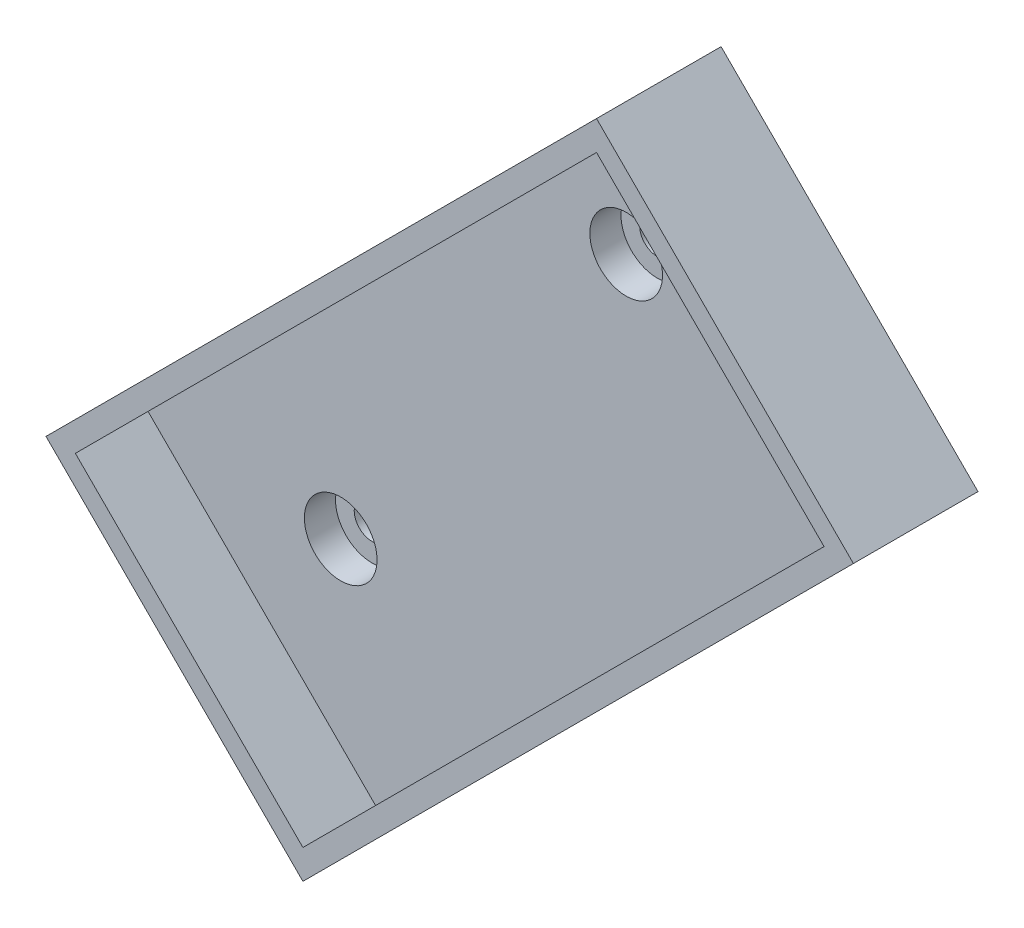
ISO-10303-21;
HEADER;
FILE_DESCRIPTION(('STEP AP214'),'2;1');
FILE_NAME('part.step','',(''),(''),'','','');
FILE_SCHEMA(('AUTOMOTIVE_DESIGN { 1 0 10303 214 1 1 1 1 }'));
ENDSEC;
DATA;
#1=APPLICATION_CONTEXT('core data for automotive mechanical design processes');
#2=APPLICATION_PROTOCOL_DEFINITION('international standard','automotive_design',2000,#1);
#3=PRODUCT_CONTEXT('',#1,'mechanical');
#4=PRODUCT('Part','Part','',(#3));
#5=PRODUCT_RELATED_PRODUCT_CATEGORY('part','',(#4));
#6=PRODUCT_DEFINITION_FORMATION('','',#4);
#7=PRODUCT_DEFINITION_CONTEXT('part definition',#1,'design');
#8=PRODUCT_DEFINITION('design','',#6,#7);
#9=PRODUCT_DEFINITION_SHAPE('','',#8);
#10=(LENGTH_UNIT() NAMED_UNIT(*) SI_UNIT(.MILLI.,.METRE.));
#11=(NAMED_UNIT(*) PLANE_ANGLE_UNIT() SI_UNIT($,.RADIAN.));
#12=(NAMED_UNIT(*) SI_UNIT($,.STERADIAN.) SOLID_ANGLE_UNIT());
#13=UNCERTAINTY_MEASURE_WITH_UNIT(LENGTH_MEASURE(1.E-05),#10,'distance_accuracy_value','');
#14=(GEOMETRIC_REPRESENTATION_CONTEXT(3) GLOBAL_UNCERTAINTY_ASSIGNED_CONTEXT((#13)) GLOBAL_UNIT_ASSIGNED_CONTEXT((#10,
#11,#12)) REPRESENTATION_CONTEXT('',''));
#15=CARTESIAN_POINT('',(0.,0.,0.));
#16=DIRECTION('',(0.,0.,1.));
#17=DIRECTION('',(1.,0.,0.));
#18=AXIS2_PLACEMENT_3D('',#15,#16,#17);
#19=CARTESIAN_POINT('',(10.,-40.,102.));
#20=DIRECTION('',(0.,0.,1.));
#21=DIRECTION('',(0.707106781186548,0.707106781186548,0.));
#22=AXIS2_PLACEMENT_3D('',#19,#20,#21);
#23=CYLINDRICAL_SURFACE('',#22,3.5);
#24=DIRECTION('',(0.,0.,1.));
#25=VECTOR('',#24,1.);
#26=CARTESIAN_POINT('',(12.474873734153,-37.52512626584,102.));
#27=LINE('',#26,#25);
#28=CARTESIAN_POINT('',(12.474873734153,-37.52512626584,102.));
#29=VERTEX_POINT('',#28);
#30=CARTESIAN_POINT('',(12.474873734153,-37.52512626584,105.));
#31=VERTEX_POINT('',#30);
#32=EDGE_CURVE('E10',#29,#31,#27,.T.);
#33=ORIENTED_EDGE('',*,*,#32,.F.);
#34=CARTESIAN_POINT('',(10.,-40.,102.));
#35=DIRECTION('',(0.,0.,1.));
#36=DIRECTION('',(0.707106781186548,0.707106781186548,0.));
#37=AXIS2_PLACEMENT_3D('',#34,#35,#36);
#38=CIRCLE('',#37,3.5);
#39=EDGE_CURVE('E155',#29,#29,#38,.T.);
#40=ORIENTED_EDGE('',*,*,#39,.F.);
#41=ORIENTED_EDGE('',*,*,#32,.T.);
#42=CARTESIAN_POINT('',(10.,-40.,105.));
#43=DIRECTION('',(0.,0.,1.));
#44=DIRECTION('',(0.707106781186548,0.707106781186548,0.));
#45=AXIS2_PLACEMENT_3D('',#42,#43,#44);
#46=CIRCLE('',#45,3.5);
#47=EDGE_CURVE('E140',#31,#31,#46,.T.);
#48=ORIENTED_EDGE('',*,*,#47,.T.);
#49=EDGE_LOOP('',(#33,#40,#41,#48));
#50=FACE_BOUND('',#49,.T.);
#51=ADVANCED_FACE('F15',(#50),#23,.F.);
#52=CARTESIAN_POINT('',(-17.5,-77.5,102.));
#53=DIRECTION('',(0.,0.,1.));
#54=DIRECTION('',(0.707106781186548,0.707106781186548,0.));
#55=AXIS2_PLACEMENT_3D('',#52,#53,#54);
#56=CYLINDRICAL_SURFACE('',#55,3.5);
#57=DIRECTION('',(0.,0.,1.));
#58=VECTOR('',#57,1.);
#59=CARTESIAN_POINT('',(-15.02512626584,-75.02512626584,102.));
#60=LINE('',#59,#58);
#61=CARTESIAN_POINT('',(-15.02512626584,-75.02512626584,102.));
#62=VERTEX_POINT('',#61);
#63=CARTESIAN_POINT('',(-15.02512626584,-75.02512626584,105.));
#64=VERTEX_POINT('',#63);
#65=EDGE_CURVE('E25',#62,#64,#60,.T.);
#66=ORIENTED_EDGE('',*,*,#65,.F.);
#67=CARTESIAN_POINT('',(-17.5,-77.5,102.));
#68=DIRECTION('',(0.,0.,1.));
#69=DIRECTION('',(0.707106781186548,0.707106781186548,0.));
#70=AXIS2_PLACEMENT_3D('',#67,#68,#69);
#71=CIRCLE('',#70,3.5);
#72=EDGE_CURVE('E151',#62,#62,#71,.T.);
#73=ORIENTED_EDGE('',*,*,#72,.F.);
#74=ORIENTED_EDGE('',*,*,#65,.T.);
#75=CARTESIAN_POINT('',(-17.5,-77.5,105.));
#76=DIRECTION('',(0.,0.,1.));
#77=DIRECTION('',(0.707106781186548,0.707106781186548,0.));
#78=AXIS2_PLACEMENT_3D('',#75,#76,#77);
#79=CIRCLE('',#78,3.5);
#80=EDGE_CURVE('E213',#64,#64,#79,.T.);
#81=ORIENTED_EDGE('',*,*,#80,.T.);
#82=EDGE_LOOP('',(#66,#73,#74,#81));
#83=FACE_BOUND('',#82,.T.);
#84=ADVANCED_FACE('F341',(#83),#56,.F.);
#85=CARTESIAN_POINT('',(-14.14213562373,-100.8908729652,105.));
#86=DIRECTION('',(0.,0.,1.));
#87=DIRECTION('',(1.,0.,0.));
#88=AXIS2_PLACEMENT_3D('',#85,#86,#87);
#89=PLANE('',#88);
#90=ORIENTED_EDGE('',*,*,#47,.F.);
#91=EDGE_LOOP('',(#90));
#92=FACE_BOUND('',#91,.T.);
#93=ORIENTED_EDGE('',*,*,#80,.F.);
#94=EDGE_LOOP('',(#93));
#95=FACE_BOUND('',#94,.T.);
#96=DIRECTION('',(-0.707106781186548,-0.707106781186548,0.));
#97=VECTOR('',#96,1.);
#98=CARTESIAN_POINT('',(-14.84924240491,-98.7695526217,105.));
#99=LINE('',#98,#97);
#100=CARTESIAN_POINT('',(36.062445840514,-47.85786437626,105.));
#101=VERTEX_POINT('',#100);
#102=CARTESIAN_POINT('',(-14.14213562373,-98.06244584051,105.));
#103=VERTEX_POINT('',#102);
#104=EDGE_CURVE('E116',#101,#103,#99,.T.);
#105=ORIENTED_EDGE('',*,*,#104,.F.);
#106=DIRECTION('',(-0.707106781186548,0.707106781186548,0.));
#107=VECTOR('',#106,1.);
#108=CARTESIAN_POINT('',(36.7695526217,-48.56497115745,105.));
#109=LINE('',#108,#107);
#110=CARTESIAN_POINT('',(14.142135623731,-25.93755415948,105.));
#111=VERTEX_POINT('',#110);
#112=EDGE_CURVE('E113',#101,#111,#109,.T.);
#113=ORIENTED_EDGE('',*,*,#112,.T.);
#114=DIRECTION('',(-0.707106781186548,-0.707106781186548,0.));
#115=VECTOR('',#114,1.);
#116=CARTESIAN_POINT('',(-36.7695526217,-76.84924240491,105.));
#117=LINE('',#116,#115);
#118=CARTESIAN_POINT('',(-36.06244584051,-76.14213562373,105.));
#119=VERTEX_POINT('',#118);
#120=EDGE_CURVE('E98',#111,#119,#117,.T.);
#121=ORIENTED_EDGE('',*,*,#120,.T.);
#122=DIRECTION('',(-0.707106781186548,0.707106781186548,0.));
#123=VECTOR('',#122,1.);
#124=CARTESIAN_POINT('',(-13.43502884254,-98.7695526217,105.));
#125=LINE('',#124,#123);
#126=EDGE_CURVE('E109',#103,#119,#125,.T.);
#127=ORIENTED_EDGE('',*,*,#126,.F.);
#128=EDGE_LOOP('',(#105,#113,#121,#127));
#129=FACE_BOUND('',#128,.T.);
#130=ADVANCED_FACE('F114',(#92,#95,#129),#89,.T.);
#131=CARTESIAN_POINT('',(10.,-40.,102.));
#132=DIRECTION('',(0.,0.,1.));
#133=DIRECTION('',(1.,0.,0.));
#134=AXIS2_PLACEMENT_3D('',#131,#132,#133);
#135=PLANE('',#134);
#136=CARTESIAN_POINT('',(10.,-40.,102.));
#137=DIRECTION('',(0.,0.,1.));
#138=DIRECTION('',(0.707106781186548,0.707106781186548,0.));
#139=AXIS2_PLACEMENT_3D('',#136,#137,#138);
#140=CIRCLE('',#139,1.7);
#141=CARTESIAN_POINT('',(11.202081528017,-38.79791847198,102.));
#142=VERTEX_POINT('',#141);
#143=EDGE_CURVE('E199',#142,#142,#140,.T.);
#144=ORIENTED_EDGE('',*,*,#143,.F.);
#145=EDGE_LOOP('',(#144));
#146=FACE_BOUND('',#145,.T.);
#147=ORIENTED_EDGE('',*,*,#39,.T.);
#148=EDGE_LOOP('',(#147));
#149=FACE_BOUND('',#148,.T.);
#150=ADVANCED_FACE('F362',(#146,#149),#135,.T.);
#151=CARTESIAN_POINT('',(-17.5,-77.5,102.));
#152=DIRECTION('',(0.,0.,1.));
#153=DIRECTION('',(1.,0.,0.));
#154=AXIS2_PLACEMENT_3D('',#151,#152,#153);
#155=PLANE('',#154);
#156=CARTESIAN_POINT('',(-17.5,-77.5,102.));
#157=DIRECTION('',(0.,0.,1.));
#158=DIRECTION('',(0.707106781186548,0.707106781186548,0.));
#159=AXIS2_PLACEMENT_3D('',#156,#157,#158);
#160=CIRCLE('',#159,1.7);
#161=CARTESIAN_POINT('',(-16.29791847198,-76.29791847198,102.));
#162=VERTEX_POINT('',#161);
#163=EDGE_CURVE('E162',#162,#162,#160,.T.);
#164=ORIENTED_EDGE('',*,*,#163,.F.);
#165=EDGE_LOOP('',(#164));
#166=FACE_BOUND('',#165,.T.);
#167=ORIENTED_EDGE('',*,*,#72,.T.);
#168=EDGE_LOOP('',(#167));
#169=FACE_BOUND('',#168,.T.);
#170=ADVANCED_FACE('F319',(#166,#169),#155,.T.);
#171=CARTESIAN_POINT('',(-14.14213562373,-98.06244584051,104.9));
#172=DIRECTION('',(0.707106781186548,0.707106781186548,0.));
#173=DIRECTION('',(0.,0.,-1.));
#174=AXIS2_PLACEMENT_3D('',#171,#172,#173);
#175=PLANE('',#174);
#176=DIRECTION('',(0.,0.,1.));
#177=VECTOR('',#176,1.);
#178=CARTESIAN_POINT('',(-14.14213562373,-98.06244584051,104.9));
#179=LINE('',#178,#177);
#180=CARTESIAN_POINT('',(-14.14213562373,-98.06244584051,112.));
#181=VERTEX_POINT('',#180);
#182=EDGE_CURVE('E127',#103,#181,#179,.T.);
#183=ORIENTED_EDGE('',*,*,#182,.F.);
#184=ORIENTED_EDGE('',*,*,#126,.T.);
#185=DIRECTION('',(0.,0.,1.));
#186=VECTOR('',#185,1.);
#187=CARTESIAN_POINT('',(-36.06244584051,-76.14213562373,104.9));
#188=LINE('',#187,#186);
#189=CARTESIAN_POINT('',(-36.06244584051,-76.14213562373,112.));
#190=VERTEX_POINT('',#189);
#191=EDGE_CURVE('E106',#119,#190,#188,.T.);
#192=ORIENTED_EDGE('',*,*,#191,.T.);
#193=DIRECTION('',(-0.707106781186548,0.707106781186548,0.));
#194=VECTOR('',#193,1.);
#195=CARTESIAN_POINT('',(-13.43502884254,-98.7695526217,112.));
#196=LINE('',#195,#194);
#197=EDGE_CURVE('E174',#181,#190,#196,.T.);
#198=ORIENTED_EDGE('',*,*,#197,.F.);
#199=EDGE_LOOP('',(#183,#184,#192,#198));
#200=FACE_BOUND('',#199,.T.);
#201=ADVANCED_FACE('F184',(#200),#175,.T.);
#202=CARTESIAN_POINT('',(-36.06244584051,-76.14213562373,104.9));
#203=DIRECTION('',(-0.707106781186548,0.707106781186548,0.));
#204=DIRECTION('',(0.,0.,1.));
#205=AXIS2_PLACEMENT_3D('',#202,#203,#204);
#206=PLANE('',#205);
#207=DIRECTION('',(-0.707106781186548,-0.707106781186548,0.));
#208=VECTOR('',#207,1.);
#209=CARTESIAN_POINT('',(-36.7695526217,-76.84924240491,112.));
#210=LINE('',#209,#208);
#211=CARTESIAN_POINT('',(14.142135623731,-25.93755415948,112.));
#212=VERTEX_POINT('',#211);
#213=EDGE_CURVE('E171',#212,#190,#210,.T.);
#214=ORIENTED_EDGE('',*,*,#213,.T.);
#215=ORIENTED_EDGE('',*,*,#191,.F.);
#216=ORIENTED_EDGE('',*,*,#120,.F.);
#217=DIRECTION('',(0.,0.,1.));
#218=VECTOR('',#217,1.);
#219=CARTESIAN_POINT('',(14.142135623731,-25.93755415948,104.9));
#220=LINE('',#219,#218);
#221=EDGE_CURVE('E103',#111,#212,#220,.T.);
#222=ORIENTED_EDGE('',*,*,#221,.T.);
#223=EDGE_LOOP('',(#214,#215,#216,#222));
#224=FACE_BOUND('',#223,.T.);
#225=ADVANCED_FACE('F101',(#224),#206,.F.);
#226=CARTESIAN_POINT('',(36.062445840514,-47.85786437626,104.9));
#227=DIRECTION('',(0.707106781186548,0.707106781186548,0.));
#228=DIRECTION('',(0.,0.,-1.));
#229=AXIS2_PLACEMENT_3D('',#226,#227,#228);
#230=PLANE('',#229);
#231=DIRECTION('',(-0.707106781186548,0.707106781186548,0.));
#232=VECTOR('',#231,1.);
#233=CARTESIAN_POINT('',(36.7695526217,-48.56497115745,112.));
#234=LINE('',#233,#232);
#235=CARTESIAN_POINT('',(36.062445840514,-47.85786437626,112.));
#236=VERTEX_POINT('',#235);
#237=EDGE_CURVE('E124',#236,#212,#234,.T.);
#238=ORIENTED_EDGE('',*,*,#237,.T.);
#239=ORIENTED_EDGE('',*,*,#221,.F.);
#240=ORIENTED_EDGE('',*,*,#112,.F.);
#241=DIRECTION('',(0.,0.,1.));
#242=VECTOR('',#241,1.);
#243=CARTESIAN_POINT('',(36.062445840514,-47.85786437626,104.9));
#244=LINE('',#243,#242);
#245=EDGE_CURVE('E192',#101,#236,#244,.T.);
#246=ORIENTED_EDGE('',*,*,#245,.T.);
#247=EDGE_LOOP('',(#238,#239,#240,#246));
#248=FACE_BOUND('',#247,.T.);
#249=ADVANCED_FACE('F122',(#248),#230,.F.);
#250=CARTESIAN_POINT('',(-14.14213562373,-98.06244584051,104.9));
#251=DIRECTION('',(-0.707106781186548,0.707106781186548,0.));
#252=DIRECTION('',(0.,0.,1.));
#253=AXIS2_PLACEMENT_3D('',#250,#251,#252);
#254=PLANE('',#253);
#255=ORIENTED_EDGE('',*,*,#245,.F.);
#256=ORIENTED_EDGE('',*,*,#104,.T.);
#257=ORIENTED_EDGE('',*,*,#182,.T.);
#258=DIRECTION('',(-0.707106781186548,-0.707106781186548,0.));
#259=VECTOR('',#258,1.);
#260=CARTESIAN_POINT('',(-14.84924240491,-98.7695526217,112.));
#261=LINE('',#260,#259);
#262=EDGE_CURVE('E205',#236,#181,#261,.T.);
#263=ORIENTED_EDGE('',*,*,#262,.F.);
#264=EDGE_LOOP('',(#255,#256,#257,#263));
#265=FACE_BOUND('',#264,.T.);
#266=ADVANCED_FACE('F191',(#265),#254,.T.);
#267=CARTESIAN_POINT('',(10.,-40.,99.9));
#268=DIRECTION('',(0.,0.,1.));
#269=DIRECTION('',(0.707106781186548,0.707106781186548,0.));
#270=AXIS2_PLACEMENT_3D('',#267,#268,#269);
#271=CYLINDRICAL_SURFACE('',#270,1.7);
#272=DIRECTION('',(0.,0.,1.));
#273=VECTOR('',#272,1.);
#274=CARTESIAN_POINT('',(11.202081528017,-38.79791847198,99.9));
#275=LINE('',#274,#273);
#276=CARTESIAN_POINT('',(11.202081528017,-38.79791847198,100.));
#277=VERTEX_POINT('',#276);
#278=EDGE_CURVE('E166',#277,#142,#275,.T.);
#279=ORIENTED_EDGE('',*,*,#278,.F.);
#280=CARTESIAN_POINT('',(10.,-40.,100.));
#281=DIRECTION('',(0.,0.,1.));
#282=DIRECTION('',(0.707106781186548,0.707106781186548,0.));
#283=AXIS2_PLACEMENT_3D('',#280,#281,#282);
#284=CIRCLE('',#283,1.7);
#285=EDGE_CURVE('E160',#277,#277,#284,.T.);
#286=ORIENTED_EDGE('',*,*,#285,.F.);
#287=ORIENTED_EDGE('',*,*,#278,.T.);
#288=ORIENTED_EDGE('',*,*,#143,.T.);
#289=EDGE_LOOP('',(#279,#286,#287,#288));
#290=FACE_BOUND('',#289,.T.);
#291=ADVANCED_FACE('F294',(#290),#271,.F.);
#292=CARTESIAN_POINT('',(-17.5,-77.5,99.9));
#293=DIRECTION('',(0.,0.,1.));
#294=DIRECTION('',(0.707106781186548,0.707106781186548,0.));
#295=AXIS2_PLACEMENT_3D('',#292,#293,#294);
#296=CYLINDRICAL_SURFACE('',#295,1.7);
#297=DIRECTION('',(0.,0.,1.));
#298=VECTOR('',#297,1.);
#299=CARTESIAN_POINT('',(-16.29791847198,-76.29791847198,99.9));
#300=LINE('',#299,#298);
#301=CARTESIAN_POINT('',(-16.29791847198,-76.29791847198,100.));
#302=VERTEX_POINT('',#301);
#303=EDGE_CURVE('E137',#302,#162,#300,.T.);
#304=ORIENTED_EDGE('',*,*,#303,.F.);
#305=CARTESIAN_POINT('',(-17.5,-77.5,100.));
#306=DIRECTION('',(0.,0.,1.));
#307=DIRECTION('',(0.707106781186548,0.707106781186548,0.));
#308=AXIS2_PLACEMENT_3D('',#305,#306,#307);
#309=CIRCLE('',#308,1.7);
#310=EDGE_CURVE('E156',#302,#302,#309,.T.);
#311=ORIENTED_EDGE('',*,*,#310,.F.);
#312=ORIENTED_EDGE('',*,*,#303,.T.);
#313=ORIENTED_EDGE('',*,*,#163,.T.);
#314=EDGE_LOOP('',(#304,#311,#312,#313));
#315=FACE_BOUND('',#314,.T.);
#316=ADVANCED_FACE('F247',(#315),#296,.F.);
#317=CARTESIAN_POINT('',(38.89087296526,-47.85786437626,100.));
#318=DIRECTION('',(0.707106781186548,0.707106781186548,0.));
#319=DIRECTION('',(0.,0.,-1.));
#320=AXIS2_PLACEMENT_3D('',#317,#318,#319);
#321=PLANE('',#320);
#322=DIRECTION('',(0.,0.,1.));
#323=VECTOR('',#322,1.);
#324=CARTESIAN_POINT('',(38.89087296526,-47.85786437626,100.));
#325=LINE('',#324,#323);
#326=CARTESIAN_POINT('',(38.89087296526,-47.85786437626,100.));
#327=VERTEX_POINT('',#326);
#328=CARTESIAN_POINT('',(38.89087296526,-47.85786437626,112.));
#329=VERTEX_POINT('',#328);
#330=EDGE_CURVE('E212',#327,#329,#325,.T.);
#331=ORIENTED_EDGE('',*,*,#330,.F.);
#332=DIRECTION('',(-0.707106781186548,0.707106781186548,0.));
#333=VECTOR('',#332,1.);
#334=CARTESIAN_POINT('',(38.89087296526,-47.85786437626,100.));
#335=LINE('',#334,#333);
#336=CARTESIAN_POINT('',(14.142135623731,-23.10912703474,100.));
#337=VERTEX_POINT('',#336);
#338=EDGE_CURVE('E161',#327,#337,#335,.T.);
#339=ORIENTED_EDGE('',*,*,#338,.T.);
#340=DIRECTION('',(0.,0.,-1.));
#341=VECTOR('',#340,1.);
#342=CARTESIAN_POINT('',(14.142135623731,-23.10912703474,112.));
#343=LINE('',#342,#341);
#344=CARTESIAN_POINT('',(14.142135623731,-23.10912703474,112.));
#345=VERTEX_POINT('',#344);
#346=EDGE_CURVE('E141',#345,#337,#343,.T.);
#347=ORIENTED_EDGE('',*,*,#346,.F.);
#348=DIRECTION('',(-0.707106781186548,0.707106781186548,0.));
#349=VECTOR('',#348,1.);
#350=CARTESIAN_POINT('',(38.89087296526,-47.85786437626,112.));
#351=LINE('',#350,#349);
#352=EDGE_CURVE('E144',#329,#345,#351,.T.);
#353=ORIENTED_EDGE('',*,*,#352,.F.);
#354=EDGE_LOOP('',(#331,#339,#347,#353));
#355=FACE_BOUND('',#354,.T.);
#356=ADVANCED_FACE('F17',(#355),#321,.T.);
#357=CARTESIAN_POINT('',(-14.14213562373,-100.8908729652,112.));
#358=DIRECTION('',(0.,0.,1.));
#359=DIRECTION('',(1.,0.,0.));
#360=AXIS2_PLACEMENT_3D('',#357,#358,#359);
#361=PLANE('',#360);
#362=ORIENTED_EDGE('',*,*,#262,.T.);
#363=ORIENTED_EDGE('',*,*,#197,.T.);
#364=ORIENTED_EDGE('',*,*,#213,.F.);
#365=ORIENTED_EDGE('',*,*,#237,.F.);
#366=EDGE_LOOP('',(#362,#363,#364,#365));
#367=FACE_BOUND('',#366,.T.);
#368=DIRECTION('',(-0.707106781186548,0.707106781186548,0.));
#369=VECTOR('',#368,1.);
#370=CARTESIAN_POINT('',(-14.14213562373,-100.8908729652,112.));
#371=LINE('',#370,#369);
#372=CARTESIAN_POINT('',(-14.14213562373,-100.8908729652,112.));
#373=VERTEX_POINT('',#372);
#374=CARTESIAN_POINT('',(-38.89087296526,-76.14213562373,112.));
#375=VERTEX_POINT('',#374);
#376=EDGE_CURVE('E216',#373,#375,#371,.T.);
#377=ORIENTED_EDGE('',*,*,#376,.F.);
#378=DIRECTION('',(0.707106781186548,0.707106781186548,0.));
#379=VECTOR('',#378,1.);
#380=CARTESIAN_POINT('',(-14.14213562373,-100.8908729652,112.));
#381=LINE('',#380,#379);
#382=EDGE_CURVE('E178',#373,#329,#381,.T.);
#383=ORIENTED_EDGE('',*,*,#382,.T.);
#384=ORIENTED_EDGE('',*,*,#352,.T.);
#385=DIRECTION('',(0.707106781186548,0.707106781186548,0.));
#386=VECTOR('',#385,1.);
#387=CARTESIAN_POINT('',(-38.89087296526,-76.14213562373,112.));
#388=LINE('',#387,#386);
#389=EDGE_CURVE('E145',#375,#345,#388,.T.);
#390=ORIENTED_EDGE('',*,*,#389,.F.);
#391=EDGE_LOOP('',(#377,#383,#384,#390));
#392=FACE_BOUND('',#391,.T.);
#393=ADVANCED_FACE('F283',(#367,#392),#361,.T.);
#394=CARTESIAN_POINT('',(-38.89087296526,-76.14213562373,100.));
#395=DIRECTION('',(-0.707106781186548,0.707106781186548,0.));
#396=DIRECTION('',(0.,0.,1.));
#397=AXIS2_PLACEMENT_3D('',#394,#395,#396);
#398=PLANE('',#397);
#399=DIRECTION('',(0.707106781186548,0.707106781186548,0.));
#400=VECTOR('',#399,1.);
#401=CARTESIAN_POINT('',(-38.89087296526,-76.14213562373,100.));
#402=LINE('',#401,#400);
#403=CARTESIAN_POINT('',(-38.89087296526,-76.14213562373,100.));
#404=VERTEX_POINT('',#403);
#405=EDGE_CURVE('E170',#404,#337,#402,.T.);
#406=ORIENTED_EDGE('',*,*,#405,.F.);
#407=DIRECTION('',(0.,0.,-1.));
#408=VECTOR('',#407,1.);
#409=CARTESIAN_POINT('',(-38.89087296526,-76.14213562373,112.));
#410=LINE('',#409,#408);
#411=EDGE_CURVE('E19',#375,#404,#410,.T.);
#412=ORIENTED_EDGE('',*,*,#411,.F.);
#413=ORIENTED_EDGE('',*,*,#389,.T.);
#414=ORIENTED_EDGE('',*,*,#346,.T.);
#415=EDGE_LOOP('',(#406,#412,#413,#414));
#416=FACE_BOUND('',#415,.T.);
#417=ADVANCED_FACE('F259',(#416),#398,.T.);
#418=CARTESIAN_POINT('',(-14.14213562373,-100.8908729652,100.));
#419=DIRECTION('',(0.,0.,1.));
#420=DIRECTION('',(1.,0.,0.));
#421=AXIS2_PLACEMENT_3D('',#418,#419,#420);
#422=PLANE('',#421);
#423=ORIENTED_EDGE('',*,*,#285,.T.);
#424=EDGE_LOOP('',(#423));
#425=FACE_BOUND('',#424,.T.);
#426=ORIENTED_EDGE('',*,*,#310,.T.);
#427=EDGE_LOOP('',(#426));
#428=FACE_BOUND('',#427,.T.);
#429=ORIENTED_EDGE('',*,*,#405,.T.);
#430=ORIENTED_EDGE('',*,*,#338,.F.);
#431=DIRECTION('',(0.707106781186548,0.707106781186548,0.));
#432=VECTOR('',#431,1.);
#433=CARTESIAN_POINT('',(-14.14213562373,-100.8908729652,100.));
#434=LINE('',#433,#432);
#435=CARTESIAN_POINT('',(-14.14213562373,-100.8908729652,100.));
#436=VERTEX_POINT('',#435);
#437=EDGE_CURVE('E175',#436,#327,#434,.T.);
#438=ORIENTED_EDGE('',*,*,#437,.F.);
#439=DIRECTION('',(-0.707106781186548,0.707106781186548,0.));
#440=VECTOR('',#439,1.);
#441=CARTESIAN_POINT('',(-14.14213562373,-100.8908729652,100.));
#442=LINE('',#441,#440);
#443=EDGE_CURVE('E146',#436,#404,#442,.T.);
#444=ORIENTED_EDGE('',*,*,#443,.T.);
#445=EDGE_LOOP('',(#429,#430,#438,#444));
#446=FACE_BOUND('',#445,.T.);
#447=ADVANCED_FACE('F255',(#425,#428,#446),#422,.F.);
#448=CARTESIAN_POINT('',(-14.14213562373,-100.8908729652,100.));
#449=DIRECTION('',(-0.707106781186548,0.707106781186548,0.));
#450=DIRECTION('',(0.,0.,1.));
#451=AXIS2_PLACEMENT_3D('',#448,#449,#450);
#452=PLANE('',#451);
#453=ORIENTED_EDGE('',*,*,#330,.T.);
#454=ORIENTED_EDGE('',*,*,#382,.F.);
#455=DIRECTION('',(0.,0.,1.));
#456=VECTOR('',#455,1.);
#457=CARTESIAN_POINT('',(-14.14213562373,-100.8908729652,100.));
#458=LINE('',#457,#456);
#459=EDGE_CURVE('E149',#436,#373,#458,.T.);
#460=ORIENTED_EDGE('',*,*,#459,.F.);
#461=ORIENTED_EDGE('',*,*,#437,.T.);
#462=EDGE_LOOP('',(#453,#454,#460,#461));
#463=FACE_BOUND('',#462,.T.);
#464=ADVANCED_FACE('F258',(#463),#452,.F.);
#465=CARTESIAN_POINT('',(-14.14213562373,-100.8908729652,100.));
#466=DIRECTION('',(0.707106781186548,0.707106781186548,0.));
#467=DIRECTION('',(0.,0.,-1.));
#468=AXIS2_PLACEMENT_3D('',#465,#466,#467);
#469=PLANE('',#468);
#470=ORIENTED_EDGE('',*,*,#376,.T.);
#471=ORIENTED_EDGE('',*,*,#411,.T.);
#472=ORIENTED_EDGE('',*,*,#443,.F.);
#473=ORIENTED_EDGE('',*,*,#459,.T.);
#474=EDGE_LOOP('',(#470,#471,#472,#473));
#475=FACE_BOUND('',#474,.T.);
#476=ADVANCED_FACE('F277',(#475),#469,.F.);
#477=CLOSED_SHELL('',(#51,#84,#130,#150,#170,#201,#225,#249,#266,#291,#316,#356,#393,#417,#447,
#464,#476));
#478=MANIFOLD_SOLID_BREP('B1',#477);
#479=ADVANCED_BREP_SHAPE_REPRESENTATION('',(#18,#478),#14);
#480=SHAPE_DEFINITION_REPRESENTATION(#9,#479);
ENDSEC;
END-ISO-10303-21;
